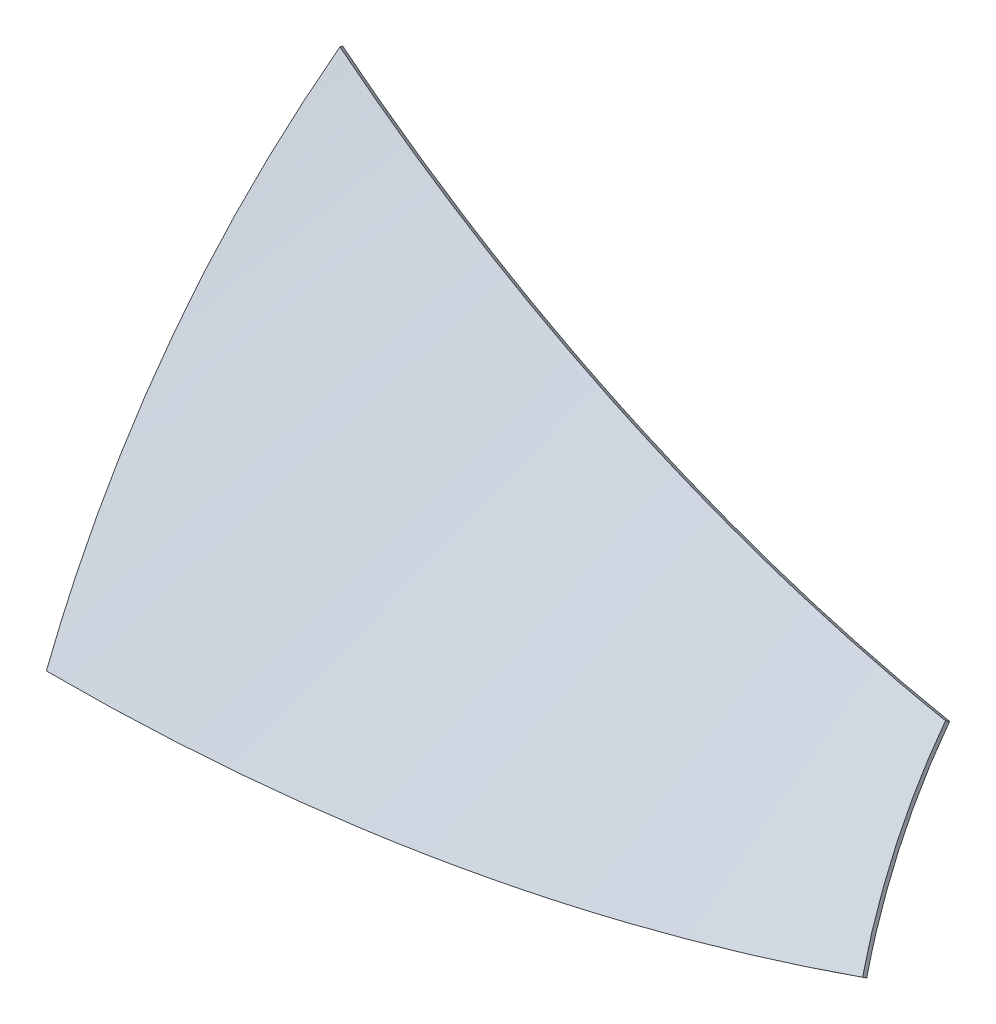
ISO-10303-21;
HEADER;
FILE_DESCRIPTION(('STEP AP214'),'2;1');
FILE_NAME('part.step','',(''),(''),'','','');
FILE_SCHEMA(('AUTOMOTIVE_DESIGN { 1 0 10303 214 1 1 1 1 }'));
ENDSEC;
DATA;
#1=APPLICATION_CONTEXT('core data for automotive mechanical design processes');
#2=APPLICATION_PROTOCOL_DEFINITION('international standard','automotive_design',2000,#1);
#3=PRODUCT_CONTEXT('',#1,'mechanical');
#4=PRODUCT('Part','Part','',(#3));
#5=PRODUCT_RELATED_PRODUCT_CATEGORY('part','',(#4));
#6=PRODUCT_DEFINITION_FORMATION('','',#4);
#7=PRODUCT_DEFINITION_CONTEXT('part definition',#1,'design');
#8=PRODUCT_DEFINITION('design','',#6,#7);
#9=PRODUCT_DEFINITION_SHAPE('','',#8);
#10=(LENGTH_UNIT() NAMED_UNIT(*) SI_UNIT(.MILLI.,.METRE.));
#11=(NAMED_UNIT(*) PLANE_ANGLE_UNIT() SI_UNIT($,.RADIAN.));
#12=(NAMED_UNIT(*) SI_UNIT($,.STERADIAN.) SOLID_ANGLE_UNIT());
#13=UNCERTAINTY_MEASURE_WITH_UNIT(LENGTH_MEASURE(1.E-05),#10,'distance_accuracy_value','');
#14=(GEOMETRIC_REPRESENTATION_CONTEXT(3) GLOBAL_UNCERTAINTY_ASSIGNED_CONTEXT((#13)) GLOBAL_UNIT_ASSIGNED_CONTEXT((#10,
#11,#12)) REPRESENTATION_CONTEXT('',''));
#15=CARTESIAN_POINT('',(0.,0.,0.));
#16=DIRECTION('',(0.,0.,1.));
#17=DIRECTION('',(1.,0.,0.));
#18=AXIS2_PLACEMENT_3D('',#15,#16,#17);
#19=CARTESIAN_POINT('',(119.275958422764,-87.4587045267184,-2.70380006520977));
#20=DIRECTION('',(0.,0.,1.));
#21=DIRECTION('',(1.,0.,0.));
#22=AXIS2_PLACEMENT_3D('',#19,#20,#21);
#23=CONICAL_SURFACE('',#22,60.5897364806192,0.959931088596881);
#24=CARTESIAN_POINT('',(88.2653044496329,-139.422911125247,-2.75685890943692));
#25=CARTESIAN_POINT('',(88.393896761644,-139.452100105852,-2.78545030760044));
#26=CARTESIAN_POINT('',(88.5225869281233,-139.480822216967,-2.81408465075337));
#27=CARTESIAN_POINT('',(89.1665572157071,-139.622109150888,-2.9574772601851));
#28=CARTESIAN_POINT('',(89.6832511441944,-139.727669930494,-3.07286608187321));
#29=CARTESIAN_POINT('',(90.7191910914132,-139.923853018244,-3.304871437824));
#30=CARTESIAN_POINT('',(91.2384371073349,-140.01447534283,-3.42148797073522));
#31=CARTESIAN_POINT('',(92.018860616663,-140.139187781278,-3.59725922924028));
#32=CARTESIAN_POINT('',(92.2792511609862,-140.178887152404,-3.65598852684919));
#33=CARTESIAN_POINT('',(93.0612000252367,-140.292381038128,-3.83260380131223));
#34=CARTESIAN_POINT('',(93.5834973477015,-140.360564654122,-3.95090857468665));
#35=CARTESIAN_POINT('',(94.3680143484509,-140.451571227305,-4.12913904036266));
#36=CARTESIAN_POINT('',(94.6296888622662,-140.480027769438,-4.18867587316264));
#37=CARTESIAN_POINT('',(95.4152550830907,-140.559760149398,-4.36768486040282));
#38=CARTESIAN_POINT('',(95.93965083618,-140.605393696889,-4.48754675442123));
#39=CARTESIAN_POINT('',(96.7268405724702,-140.662497319073,-4.66807199485579));
#40=CARTESIAN_POINT('',(96.9893268118299,-140.679640320303,-4.72836690461267));
#41=CARTESIAN_POINT('',(97.7770831924483,-140.725374175187,-4.90963991512032));
#42=CARTESIAN_POINT('',(98.3026117742748,-140.748266463702,-5.03099733539828));
#43=CARTESIAN_POINT('',(99.3538884486126,-140.778889220489,-5.27461795686905));
#44=CARTESIAN_POINT('',(99.8796365408709,-140.78661970618,-5.39688115702113));
#45=CARTESIAN_POINT('',(100.930958509344,-140.78702326399,-5.64218466158254));
#46=CARTESIAN_POINT('',(101.45653238575,-140.779696352731,-5.76522496513391));
#47=CARTESIAN_POINT('',(102.507097778709,-140.750050638456,-6.01197750042769));
#48=CARTESIAN_POINT('',(103.032089295673,-140.727731846034,-6.13568973169523));
#49=CARTESIAN_POINT('',(104.081086532354,-140.668155983594,-6.38369328141814));
#50=CARTESIAN_POINT('',(104.60509225239,-140.630898918403,-6.50798459968634));
#51=CARTESIAN_POINT('',(105.651712034309,-140.541480844823,-6.75706963427749));
#52=CARTESIAN_POINT('',(106.174326096123,-140.489319835691,-6.88186335062549));
#53=CARTESIAN_POINT('',(107.217745616381,-140.370115549256,-7.13188729522214));
#54=CARTESIAN_POINT('',(107.738551074074,-140.303072265766,-7.25711752365226));
#55=CARTESIAN_POINT('',(109.105530507758,-140.107147379602,-7.58703761521449));
#56=CARTESIAN_POINT('',(109.949870319747,-139.965924551795,-7.79205744793588));
#57=CARTESIAN_POINT('',(110.790394964173,-139.804906318109,-7.99752302693658));
#58=B_SPLINE_CURVE_WITH_KNOTS('',3,(#24,#25,#26,#27,#28,#29,#30,#31,#32,#33,#34,#35,#36,#37,#38,
#39,#40,#41,#42,#43,#44,#45,#46,#47,#48,#49,#50,#51,#52,#53,#54,#55,#56,#57),.UNSPECIFIED.,.F.,
.F.,(4,2,2,2,2,2,2,2,2,2,2,2,2,2,2,2,4),(0.,0.404785684554634,2.02408017378369,3.64337288067617,
4.45295905942151,6.07225061300535,6.88183676558975,8.50112882769166,9.31071515183369,
10.9300088916539,12.5493007712221,14.1685908633269,15.7878798111893,17.4071682357331,
19.0264567410057,20.6457459195014,23.2857187531543),.UNSPECIFIED.);
#59=CARTESIAN_POINT('',(88.2653044496328,-139.422911125247,-2.75685890943719));
#60=VERTEX_POINT('',#59);
#61=CARTESIAN_POINT('',(110.790394964173,-139.804906318109,-7.99752302693623));
#62=VERTEX_POINT('',#61);
#63=EDGE_CURVE('E24',#60,#62,#58,.T.);
#64=ORIENTED_EDGE('',*,*,#63,.T.);
#65=CARTESIAN_POINT('',(110.790394964173,-139.804906318109,-7.99752302693617));
#66=CARTESIAN_POINT('',(110.753714931839,-139.696425813194,-8.06839270908194));
#67=CARTESIAN_POINT('',(110.718354373568,-139.587667966176,-8.1395459575294));
#68=CARTESIAN_POINT('',(110.547999087685,-139.042323136617,-8.49686090490331));
#69=CARTESIAN_POINT('',(110.432678470962,-138.602026288922,-8.78704423252041));
#70=CARTESIAN_POINT('',(110.281985262496,-137.900229070604,-9.25266430868405));
#71=CARTESIAN_POINT('',(110.233269054765,-137.640044585737,-9.42595602925358));
#72=CARTESIAN_POINT('',(110.17365071207,-137.26846977861,-9.67445744911113));
#73=CARTESIAN_POINT('',(110.157097662991,-137.157425462057,-9.74885104371482));
#74=CARTESIAN_POINT('',(110.089033386873,-136.663417590621,-10.0804026850153));
#75=CARTESIAN_POINT('',(110.051054361181,-136.279734352034,-10.3394946224089));
#76=CARTESIAN_POINT('',(110.021033180158,-135.785115570535,-10.6757424971134));
#77=CARTESIAN_POINT('',(110.015519611322,-135.673894075686,-10.7514987942405));
#78=CARTESIAN_POINT('',(109.996821839207,-135.187314737827,-11.0835807574487));
#79=CARTESIAN_POINT('',(109.996546326534,-134.81236951143,-11.3411894895932));
#80=CARTESIAN_POINT('',(110.010517152515,-134.438391626709,-11.5999996128498));
#81=B_SPLINE_CURVE_WITH_KNOTS('',3,(#65,#66,#67,#68,#69,#70,#71,#72,#73,#74,#75,#76,#77,#78,#79,
#80),.UNSPECIFIED.,.F.,.F.,(4,2,2,2,2,2,2,4),(0.,0.404039967199959,2.02138933712613,
2.9702678466755,3.37430460638333,4.76665393130094,5.17069019074516,6.53488990231793),.UNSPECIFIED.);
#82=CARTESIAN_POINT('',(110.010517152602,-134.4383916244,-11.5999996144474));
#83=VERTEX_POINT('',#82);
#84=EDGE_CURVE('E119',#62,#83,#81,.T.);
#85=ORIENTED_EDGE('',*,*,#84,.T.);
#86=CARTESIAN_POINT('',(110.010517153382,-134.438391622229,-11.599999616045));
#87=CARTESIAN_POINT('',(109.876803936647,-134.412020499261,-11.599999649466));
#88=CARTESIAN_POINT('',(109.743202395256,-134.385070766238,-11.6000047399863));
#89=CARTESIAN_POINT('',(109.075705497752,-134.247423125822,-11.6000530761268));
#90=CARTESIAN_POINT('',(108.543566365259,-134.12807176212,-11.6001649766074));
#91=CARTESIAN_POINT('',(107.483723169382,-133.871150154111,-11.6004735845137));
#92=CARTESIAN_POINT('',(106.956019100151,-133.733579933825,-11.6006702918276));
#93=CARTESIAN_POINT('',(105.905626921944,-133.440450857818,-11.6010958966159));
#94=CARTESIAN_POINT('',(105.382938807397,-133.284892022079,-11.6013247940546));
#95=CARTESIAN_POINT('',(104.343181389047,-132.956029561148,-11.6017712994761));
#96=CARTESIAN_POINT('',(103.82611208022,-132.782725951826,-11.6019889074691));
#97=CARTESIAN_POINT('',(102.798159483365,-132.418613461905,-11.6023789968136));
#98=CARTESIAN_POINT('',(102.287276191183,-132.227804593061,-11.6025514781955));
#99=CARTESIAN_POINT('',(101.526099373397,-131.928681501401,-11.6027589088291));
#100=CARTESIAN_POINT('',(101.273245385349,-131.826828057125,-11.6028195019014));
#101=CARTESIAN_POINT('',(100.517259147392,-131.514819195498,-11.6029726866689));
#102=CARTESIAN_POINT('',(100.016757846375,-131.298235875793,-11.6030366646342));
#103=CARTESIAN_POINT('',(99.0234100832531,-130.848216474197,-11.6030799623007));
#104=CARTESIAN_POINT('',(98.5305636203959,-130.614780393961,-11.6030592820103));
#105=CARTESIAN_POINT('',(97.5530619650028,-130.131305526145,-11.6029358242948));
#106=CARTESIAN_POINT('',(97.0684067735595,-129.881266736349,-11.6028330468589));
#107=CARTESIAN_POINT('',(96.3480668456611,-129.494000669635,-11.6026274061331));
#108=CARTESIAN_POINT('',(96.1090734157178,-129.362884749245,-11.6025502856875));
#109=CARTESIAN_POINT('',(95.3954195726011,-128.963430755543,-11.602297081798));
#110=CARTESIAN_POINT('',(94.9241383024931,-128.689013635436,-11.6020991678235));
#111=CARTESIAN_POINT('',(93.991215395238,-128.124287084647,-11.6016733387489));
#112=CARTESIAN_POINT('',(93.5295737648934,-127.833977642752,-11.6014454236276));
#113=CARTESIAN_POINT('',(92.6164681118322,-127.237740316178,-11.6009981951386));
#114=CARTESIAN_POINT('',(92.1650040985576,-126.931812417011,-11.600778881779));
#115=CARTESIAN_POINT('',(91.4959306883048,-126.461478547329,-11.6004924206048));
#116=CARTESIAN_POINT('',(91.2742719131233,-126.302802597853,-11.600404022038));
#117=CARTESIAN_POINT('',(90.4966142481542,-125.735939214698,-11.6001296377114));
#118=CARTESIAN_POINT('',(89.948065510594,-125.317518889374,-11.6000013307998));
#119=CARTESIAN_POINT('',(89.4088257709597,-124.887220242252,-11.5999996160448));
#120=B_SPLINE_CURVE_WITH_KNOTS('',3,(#86,#87,#88,#89,#90,#91,#92,#93,#94,#95,#96,#97,#98,#99,
#100,#101,#102,#103,#104,#105,#106,#107,#108,#109,#110,#111,#112,#113,#114,#115,#116,#117,#118,
#119),.UNSPECIFIED.,.F.,.F.,(4,2,2,2,2,2,2,2,2,2,2,2,2,2,2,2,4),(0.,0.408872020931432,
2.04458807157775,3.68030196551314,5.31601404246981,6.95172465645626,8.58743417202632,
9.4052000757954,11.0409086426712,12.6766170488088,14.3123256731139,15.1300916031831,
16.7658012615432,18.4015120741467,20.0372244041636,20.8549909300658,22.9242005441208),.UNSPECIFIED.);
#121=CARTESIAN_POINT('',(89.4088257530934,-124.887220241614,-11.5999996085915));
#122=VERTEX_POINT('',#121);
#123=EDGE_CURVE('E69',#83,#122,#120,.T.);
#124=ORIENTED_EDGE('',*,*,#123,.T.);
#125=CARTESIAN_POINT('',(89.4088257352271,-124.887220240975,-11.5999996011381));
#126=CARTESIAN_POINT('',(89.3779016296209,-124.996054290545,-11.5269277917907));
#127=CARTESIAN_POINT('',(89.3474488187519,-125.105068137104,-11.4539215961558));
#128=CARTESIAN_POINT('',(89.2575290620644,-125.432662347292,-11.2350971924239));
#129=CARTESIAN_POINT('',(89.1995057781798,-125.651778424142,-11.0894846119513));
#130=CARTESIAN_POINT('',(89.1154720747801,-125.981523998152,-10.8715018771175));
#131=CARTESIAN_POINT('',(89.087959239955,-126.091625439398,-10.7989086351104));
#132=CARTESIAN_POINT('',(89.033947989512,-126.312178984535,-10.6538728286795));
#133=CARTESIAN_POINT('',(89.0074495927286,-126.422631094896,-10.581430267077));
#134=CARTESIAN_POINT('',(88.9293976915674,-126.75505361794,-10.3639894850818));
#135=CARTESIAN_POINT('',(88.8794241819064,-126.977554889442,-10.219232132844));
#136=CARTESIAN_POINT('',(88.7835652643354,-127.423845471213,-9.93034163110679));
#137=CARTESIAN_POINT('',(88.7376799818415,-127.647634820774,-9.7862085008859));
#138=CARTESIAN_POINT('',(88.6496567013939,-128.096326116415,-9.49848748289399));
#139=CARTESIAN_POINT('',(88.6075190225546,-128.321228155526,-9.35489964254991));
#140=CARTESIAN_POINT('',(88.5272840580926,-128.772152766182,-9.06835651004254));
#141=CARTESIAN_POINT('',(88.4891867466627,-128.99817533056,-8.92540121384451));
#142=CARTESIAN_POINT('',(88.4172349479171,-129.451324796017,-8.64018145245308));
#143=CARTESIAN_POINT('',(88.3833803780402,-129.678451675516,-8.49791697386858));
#144=CARTESIAN_POINT('',(88.3200294496898,-130.133763798179,-8.21411565139135));
#145=CARTESIAN_POINT('',(88.2905331270712,-130.361949050034,-8.0725788134941));
#146=CARTESIAN_POINT('',(88.2085815965716,-131.047916541384,-7.64910258577528));
#147=CARTESIAN_POINT('',(88.1626532131656,-131.507177303682,-7.36825546371118));
#148=CARTESIAN_POINT('',(88.1066369613637,-132.197852977602,-6.94954731925253));
#149=CARTESIAN_POINT('',(88.0901231052264,-132.428097211561,-6.81057089688105));
#150=CARTESIAN_POINT('',(88.0613475954916,-132.889270085304,-6.53337207064989));
#151=CARTESIAN_POINT('',(88.049085456169,-133.120198643867,-6.39514958243617));
#152=CARTESIAN_POINT('',(88.0186683029978,-133.813952903367,-5.98158965049347));
#153=CARTESIAN_POINT('',(88.0068834226983,-134.277736465273,-5.70736623630085));
#154=CARTESIAN_POINT('',(88.0004420309438,-135.207246749866,-5.16201602263873));
#155=CARTESIAN_POINT('',(88.0057855587841,-135.672973477007,-4.89088923027479));
#156=CARTESIAN_POINT('',(88.0268855693072,-136.372535467331,-4.48668119873469));
#157=CARTESIAN_POINT('',(88.0360989119511,-136.60587319435,-4.35236547514312));
#158=CARTESIAN_POINT('',(88.0685412327364,-137.269124372963,-3.97199696279422));
#159=CARTESIAN_POINT('',(88.097041293366,-137.699369706526,-3.72694484440436));
#160=CARTESIAN_POINT('',(88.1694739968244,-138.560725039361,-3.23966320797299));
#161=CARTESIAN_POINT('',(88.2134219660538,-138.991835473021,-2.99743674085369));
#162=CARTESIAN_POINT('',(88.2653044496327,-139.422911125247,-2.75685890943759));
#163=B_SPLINE_CURVE_WITH_KNOTS('',3,(#125,#126,#127,#128,#129,#130,#131,#132,#133,#134,#135,
#136,#137,#138,#139,#140,#141,#142,#143,#144,#145,#146,#147,#148,#149,#150,#151,#152,#153,#154,
#155,#156,#157,#158,#159,#160,#161,#162),.UNSPECIFIED.,.F.,.F.,(4,2,2,2,2,2,2,2,2,2,2,2,2,2,2,2,
2,2,4),(0.,0.40406407316356,1.21225538269907,1.61640710272107,2.02056632268259,2.8308530331569,
3.64116459255276,4.45154508529385,5.26192040149566,6.07227994582637,6.88264615654276,
8.50313984644146,9.31144172821436,10.1196512374433,11.7361079402654,13.3525683514841,
14.1607184706315,15.6483287339153,17.1374190917304),.UNSPECIFIED.);
#164=EDGE_CURVE('E66',#122,#60,#163,.T.);
#165=ORIENTED_EDGE('',*,*,#164,.T.);
#166=EDGE_LOOP('',(#64,#85,#124,#165));
#167=FACE_BOUND('',#166,.T.);
#168=ADVANCED_FACE('F17',(#167),#23,.F.);
#169=CARTESIAN_POINT('',(110.771855136703,-139.919275806318,-8.16299173988275));
#170=CARTESIAN_POINT('',(110.771916324252,-139.918898349262,-8.16244563851989));
#171=CARTESIAN_POINT('',(110.771977511802,-139.918520892205,-8.16189953715703));
#172=CARTESIAN_POINT('',(110.772038699351,-139.918143435148,-8.16135343579417));
#173=CARTESIAN_POINT('',(110.778157454292,-139.880397729468,-8.10674329950824));
#174=CARTESIAN_POINT('',(110.784276209232,-139.842652023788,-8.05213316322231));
#175=CARTESIAN_POINT('',(110.790394964173,-139.804906318109,-7.99752302693637));
#176=CARTESIAN_POINT('',(106.529021752458,-140.729057648899,-7.12789737510281));
#177=CARTESIAN_POINT('',(106.529111784376,-140.728684863256,-7.12735127373995));
#178=CARTESIAN_POINT('',(106.529201816294,-140.728312077614,-7.12680517237709));
#179=CARTESIAN_POINT('',(106.529291848212,-140.727939291971,-7.12625907101423));
#180=CARTESIAN_POINT('',(106.538295040007,-140.690660727702,-7.07164893472829));
#181=CARTESIAN_POINT('',(106.54729256614,-140.653382562773,-7.01703879844236));
#182=CARTESIAN_POINT('',(106.556295757936,-140.616103998504,-6.96242866215643));
#183=CARTESIAN_POINT('',(98.8666998516875,-141.273733770287,-5.3157213393941));
#184=CARTESIAN_POINT('',(98.8668377177738,-141.2733747024,-5.31517523803124));
#185=CARTESIAN_POINT('',(98.8669755838602,-141.273015634514,-5.31462913666838));
#186=CARTESIAN_POINT('',(98.8671134499465,-141.272656566627,-5.31408303530552));
#187=CARTESIAN_POINT('',(98.8809000585785,-141.236749777977,-5.25947289901958));
#188=CARTESIAN_POINT('',(98.894688945884,-141.200843072913,-5.20486276273365));
#189=CARTESIAN_POINT('',(98.908475554516,-141.164936284263,-5.15025262644772));
#190=CARTESIAN_POINT('',(91.3319014460328,-140.233816048849,-3.61624611019747));
#191=CARTESIAN_POINT('',(91.3320808911593,-140.233477836437,-3.61570000883461));
#192=CARTESIAN_POINT('',(91.3322603362858,-140.233139624025,-3.61515390747175));
#193=CARTESIAN_POINT('',(91.3324397814123,-140.232801411613,-3.61460780610889));
#194=CARTESIAN_POINT('',(91.3503842940632,-140.198980170416,-3.55999766982296));
#195=CARTESIAN_POINT('',(91.3683279987264,-140.165158807644,-3.50538753353703));
#196=CARTESIAN_POINT('',(91.3862725113773,-140.131337566447,-3.45077739725109));
#197=CARTESIAN_POINT('',(88.2059302159147,-139.522403865717,-2.9223276223833));
#198=CARTESIAN_POINT('',(88.2061261704814,-139.522075506838,-2.92178152102044));
#199=CARTESIAN_POINT('',(88.2063221250482,-139.521747147958,-2.92123541965758));
#200=CARTESIAN_POINT('',(88.2065180796149,-139.521418789079,-2.92068931829472));
#201=CARTESIAN_POINT('',(88.2261135362876,-139.488582901135,-2.86607918200878));
#202=CARTESIAN_POINT('',(88.2457089929602,-139.455747013191,-2.81146904572285));
#203=CARTESIAN_POINT('',(88.2653044496329,-139.422911125247,-2.75685890943692));
#204=B_SPLINE_SURFACE_WITH_KNOTS('',3,3,((#169,#170,#171,#172,#173,#174,#175),(#176,#177,#178,
#179,#180,#181,#182),(#183,#184,#185,#186,#187,#188,#189),(#190,#191,#192,#193,#194,#195,#196),
(#197,#198,#199,#200,#201,#202,#203)),.UNSPECIFIED.,.F.,.F.,.F.,(4,1,4),(4,3,4),(0.,
0.571428571428571,1.),(-0.01,0.,1.),.UNSPECIFIED.);
#205=DIRECTION('',(0.0917813241156244,0.566185585187649,0.81915204429294));
#206=VECTOR('',#205,1.);
#207=CARTESIAN_POINT('',(110.781308613086,-139.860958691043,-8.078619079321));
#208=LINE('',#207,#206);
#209=CARTESIAN_POINT('',(110.772463806536,-139.915517282349,-8.15755361789334));
#210=VERTEX_POINT('',#209);
#211=EDGE_CURVE('E78',#210,#62,#208,.T.);
#212=DIRECTION('',(-0.293931850090619,-0.492538319160002,-0.819152044288084));
#213=VECTOR('',#212,1.);
#214=CARTESIAN_POINT('',(88.2359112646239,-139.472164957163,-2.83877411386612));
#215=LINE('',#214,#213);
#216=CARTESIAN_POINT('',(88.2065180806895,-139.521418797936,-2.92068931335483));
#217=VERTEX_POINT('',#216);
#218=EDGE_CURVE('E73',#60,#217,#215,.T.);
#219=CARTESIAN_POINT('',(110.772463182779,-139.915517401564,-8.15755346593861));
#220=CARTESIAN_POINT('',(110.644849174168,-139.939907286284,-8.12646529683646));
#221=CARTESIAN_POINT('',(110.517144155725,-139.963841517229,-8.09538663302451));
#222=CARTESIAN_POINT('',(109.878136387115,-140.081243113899,-7.94003117576611));
#223=CARTESIAN_POINT('',(109.365523506516,-140.167875110313,-7.81590158313757));
#224=CARTESIAN_POINT('',(108.337975106382,-140.326563485748,-7.56799575319069));
#225=CARTESIAN_POINT('',(107.823039589188,-140.398619879462,-7.44421951551629));
#226=CARTESIAN_POINT('',(106.791237537342,-140.528161858453,-7.19705740246975));
#227=CARTESIAN_POINT('',(106.274371003972,-140.585647453406,-7.07367152683845));
#228=CARTESIAN_POINT('',(105.239139560791,-140.686033595775,-6.82735366669601));
#229=CARTESIAN_POINT('',(104.720774651458,-140.728934147835,-6.70442168204037));
#230=CARTESIAN_POINT('',(103.163579531522,-140.835748660092,-6.33629984914824));
#231=CARTESIAN_POINT('',(102.122941697178,-140.877738743054,-6.09185421733532));
#232=CARTESIAN_POINT('',(100.561352393301,-140.896556910425,-5.72736403961631));
#233=CARTESIAN_POINT('',(100.040790707162,-140.895471741213,-5.60624729730924));
#234=CARTESIAN_POINT('',(98.9996876598481,-140.878513899878,-5.36481548478957));
#235=CARTESIAN_POINT('',(98.4791462986979,-140.8626412109,-5.24450041549079));
#236=CARTESIAN_POINT('',(97.6987241074171,-140.827668914312,-5.06474376589633));
#237=CARTESIAN_POINT('',(97.4386577210994,-140.814151626798,-5.00494635137016));
#238=CARTESIAN_POINT('',(96.6586484646242,-140.768026365461,-4.82589844801075));
#239=CARTESIAN_POINT('',(96.138933241818,-140.729846145057,-4.70700102172678));
#240=CARTESIAN_POINT('',(95.3602309993229,-140.661506728755,-4.52940004227218));
#241=CARTESIAN_POINT('',(95.1008181103966,-140.63688317341,-4.47032604581158));
#242=CARTESIAN_POINT('',(93.8041094233551,-140.504515089677,-4.17547187761334));
#243=CARTESIAN_POINT('',(92.7690038719492,-140.369112849225,-3.94149550076689));
#244=CARTESIAN_POINT('',(91.1463985393248,-140.109904291585,-3.57668835298127));
#245=CARTESIAN_POINT('',(90.5559906856174,-140.005712486013,-3.44436207563823));
#246=CARTESIAN_POINT('',(89.3785790082043,-139.778036230486,-3.1813030268735));
#247=CARTESIAN_POINT('',(88.7915750322265,-139.654552650561,-3.05057018387683));
#248=CARTESIAN_POINT('',(88.2065181335944,-139.521418801363,-2.92068933027754));
#249=B_SPLINE_CURVE_WITH_KNOTS('',3,(#219,#220,#221,#222,#223,#224,#225,#226,#227,#228,#229,
#230,#231,#232,#233,#234,#235,#236,#237,#238,#239,#240,#241,#242,#243,#244,#245,#246,#247,#248),
.UNSPECIFIED.,.F.,.F.,(4,2,2,2,2,2,2,2,2,2,2,2,2,2,4),(0.,0.400777805369769,2.00403344775429,
3.60728747401919,5.21054043569948,6.81379288692716,10.0212064599414,11.6244608019715,
13.2277169712351,14.0292872606117,15.6325440739654,16.4341141294991,19.6415499085026,
21.4831709053136,23.3247088717892),.UNSPECIFIED.);
#250=EDGE_CURVE('E113',#210,#217,#249,.T.);
#251=ORIENTED_EDGE('',*,*,#211,.T.);
#252=ORIENTED_EDGE('',*,*,#63,.F.);
#253=ORIENTED_EDGE('',*,*,#218,.T.);
#254=ORIENTED_EDGE('',*,*,#250,.F.);
#255=EDGE_LOOP('',(#251,#252,#253,#254));
#256=FACE_BOUND('',#255,.T.);
#257=ADVANCED_FACE('F75',(#256),#204,.F.);
#258=CARTESIAN_POINT('',(88.2059302159147,-139.522403865717,-2.92232762238352));
#259=CARTESIAN_POINT('',(88.2061261704814,-139.522075506838,-2.92178152102066));
#260=CARTESIAN_POINT('',(88.2063221250482,-139.521747147958,-2.9212354196578));
#261=CARTESIAN_POINT('',(88.2065180796149,-139.521418789079,-2.92068931829494));
#262=CARTESIAN_POINT('',(88.2261135362876,-139.488582901135,-2.86607918200906));
#263=CARTESIAN_POINT('',(88.2457089929602,-139.455747013191,-2.81146904572318));
#264=CARTESIAN_POINT('',(88.2653044496328,-139.422911125247,-2.75685890943731));
#265=CARTESIAN_POINT('',(88.2655023637452,-139.422579482779,-2.75630734706082));
#266=CARTESIAN_POINT('',(88.2657002778576,-139.422247840311,-2.75575578468434));
#267=CARTESIAN_POINT('',(88.26589819197,-139.421916197842,-2.75520422230785));
#268=CARTESIAN_POINT('',(87.8498503803487,-136.587857672912,-4.55903629348517));
#269=CARTESIAN_POINT('',(87.8500561438002,-136.587535161323,-4.55849019212231));
#270=CARTESIAN_POINT('',(87.8502619072518,-136.587212649734,-4.55794409075945));
#271=CARTESIAN_POINT('',(87.8504676707033,-136.586890138145,-4.55739798939659));
#272=CARTESIAN_POINT('',(87.8710440158557,-136.554638979259,-4.50278785311071));
#273=CARTESIAN_POINT('',(87.8916178116388,-136.522388204817,-4.44817771682482));
#274=CARTESIAN_POINT('',(87.9121941567912,-136.490137045931,-4.39356758053894));
#275=CARTESIAN_POINT('',(87.9124019778772,-136.489811309226,-4.39301601816245));
#276=CARTESIAN_POINT('',(87.9126097989633,-136.489485572521,-4.39246445578597));
#277=CARTESIAN_POINT('',(87.9128176200493,-136.489159835817,-4.39191289340948));
#278=CARTESIAN_POINT('',(87.8711893638283,-132.575579335741,-6.90066490513928));
#279=CARTESIAN_POINT('',(87.8714074200412,-132.575265010037,-6.90011880377642));
#280=CARTESIAN_POINT('',(87.8716254762542,-132.574950684333,-6.89957270241356));
#281=CARTESIAN_POINT('',(87.8718435324671,-132.574636358629,-6.8990266010507));
#282=CARTESIAN_POINT('',(87.8936491537624,-132.543203788214,-6.8444164647648));
#283=CARTESIAN_POINT('',(87.9154535310117,-132.511770355278,-6.7898063284789));
#284=CARTESIAN_POINT('',(87.9372591523071,-132.480337784863,-6.73519619219299));
#285=CARTESIAN_POINT('',(87.9374793890822,-132.480020315902,-6.7346446298165));
#286=CARTESIAN_POINT('',(87.9376996258573,-132.479702846941,-6.73409306744001));
#287=CARTESIAN_POINT('',(87.9379198626324,-132.479385377979,-6.73354150506353));
#288=CARTESIAN_POINT('',(88.4744336826358,-128.664095752218,-9.35520755921663));
#289=CARTESIAN_POINT('',(88.4746625656083,-128.663789411252,-9.35466145785377));
#290=CARTESIAN_POINT('',(88.4748914485808,-128.663483070285,-9.35411535649091));
#291=CARTESIAN_POINT('',(88.4751203315533,-128.663176729319,-9.35356925512805));
#292=CARTESIAN_POINT('',(88.4980086288024,-128.63254263269,-9.29895911884214));
#293=CARTESIAN_POINT('',(88.5208993438843,-128.601910112015,-9.24434898255622));
#294=CARTESIAN_POINT('',(88.5437876411334,-128.571276015386,-9.18973884627031));
#295=CARTESIAN_POINT('',(88.5440188129356,-128.57096661101,-9.18918728389382));
#296=CARTESIAN_POINT('',(88.5442499847378,-128.570657206634,-9.18863572151734));
#297=CARTESIAN_POINT('',(88.5444811565401,-128.570347802258,-9.18808415914085));
#298=CARTESIAN_POINT('',(88.8932002376887,-126.647346223877,-10.6557949244372));
#299=CARTESIAN_POINT('',(88.8934345062393,-126.647043988103,-10.6552488230743));
#300=CARTESIAN_POINT('',(88.89366877479,-126.646741752328,-10.6547027217115));
#301=CARTESIAN_POINT('',(88.8939030433406,-126.646439516554,-10.6541566203486));
#302=CARTESIAN_POINT('',(88.9173298984038,-126.616215939123,-10.5995464840626));
#303=CARTESIAN_POINT('',(88.9407539735831,-126.585990732364,-10.5449363477767));
#304=CARTESIAN_POINT('',(88.9641808286463,-126.555767154933,-10.4903262114908));
#305=CARTESIAN_POINT('',(88.9644174398824,-126.555461896801,-10.4897746491143));
#306=CARTESIAN_POINT('',(88.9646540511186,-126.555156638669,-10.4892230867378));
#307=CARTESIAN_POINT('',(88.9648906623547,-126.554851380537,-10.4886715243613));
#308=CARTESIAN_POINT('',(89.1473225436593,-125.645975795307,-11.3171126533402));
#309=CARTESIAN_POINT('',(89.1475593602472,-125.645675563887,-11.3165665519773));
#310=CARTESIAN_POINT('',(89.1477961768351,-125.645375332466,-11.3160204506145));
#311=CARTESIAN_POINT('',(89.148032993423,-125.645075101046,-11.3154743492516));
#312=CARTESIAN_POINT('',(89.1717146522129,-125.615051959002,-11.2608642129657));
#313=CARTESIAN_POINT('',(89.1954005686143,-125.585031510392,-11.2062540766797));
#314=CARTESIAN_POINT('',(89.2190822274042,-125.555008368349,-11.1516439403938));
#315=CARTESIAN_POINT('',(89.219321412158,-125.554705134614,-11.1510923780173));
#316=CARTESIAN_POINT('',(89.2195605969118,-125.55440190088,-11.1505408156408));
#317=CARTESIAN_POINT('',(89.2197997816655,-125.554098667145,-11.1499892532643));
#318=CARTESIAN_POINT('',(89.3365587519524,-124.977782870094,-11.7654683091632));
#319=CARTESIAN_POINT('',(89.3367972568409,-124.977483983553,-11.7649222078003));
#320=CARTESIAN_POINT('',(89.3370357617293,-124.977185097013,-11.7643761064375));
#321=CARTESIAN_POINT('',(89.3372742666177,-124.976886210472,-11.7638300050746));
#322=CARTESIAN_POINT('',(89.3611247554599,-124.946997556416,-11.7092198687886));
#323=CARTESIAN_POINT('',(89.3849752443021,-124.917108902361,-11.6546097325027));
#324=CARTESIAN_POINT('',(89.4088257331443,-124.887220248305,-11.5999995962168));
#325=CARTESIAN_POINT('',(89.4090666230816,-124.886918372899,-11.5994480338403));
#326=CARTESIAN_POINT('',(89.4093075130189,-124.886616497493,-11.5988964714638));
#327=CARTESIAN_POINT('',(89.4095484029562,-124.886314622087,-11.5983449090873));
#328=B_SPLINE_SURFACE_WITH_KNOTS('',3,3,((#258,#259,#260,#261,#262,#263,#264,#265,#266,#267),
(#268,#269,#270,#271,#272,#273,#274,#275,#276,#277),(#278,#279,#280,#281,#282,#283,#284,#285,
#286,#287),(#288,#289,#290,#291,#292,#293,#294,#295,#296,#297),(#298,#299,#300,#301,#302,#303,
#304,#305,#306,#307),(#308,#309,#310,#311,#312,#313,#314,#315,#316,#317),(#318,#319,#320,#321,
#322,#323,#324,#325,#326,#327)),.UNSPECIFIED.,.F.,.F.,.F.,(4,1,1,1,4),(4,3,3,4),(0.,
0.571428571428571,0.785714285714286,0.857142857142857,1.),(-0.01,0.,1.,1.0101),.UNSPECIFIED.);
#329=DIRECTION('',(-0.357757332400664,-0.448329811024342,-0.819152044287529));
#330=VECTOR('',#329,1.);
#331=CARTESIAN_POINT('',(89.372410880464,-124.932854233903,-11.6833783341897));
#332=LINE('',#331,#330);
#333=CARTESIAN_POINT('',(89.3374905445875,-124.97661535623,-11.7633350556306));
#334=VERTEX_POINT('',#333);
#335=EDGE_CURVE('E84',#122,#334,#332,.T.);
#336=CARTESIAN_POINT('',(88.2065180817642,-139.521418806794,-2.92068930841492));
#337=CARTESIAN_POINT('',(88.1924666399635,-139.405603670899,-2.98528436375661));
#338=CARTESIAN_POINT('',(88.1789893748951,-139.289783774794,-3.0499998796975));
#339=CARTESIAN_POINT('',(88.1144428502647,-138.710622785762,-3.37420292526912));
#340=CARTESIAN_POINT('',(88.071917036979,-138.247290203705,-3.635459319896));
#341=CARTESIAN_POINT('',(88.0043893935845,-137.320099258902,-4.16211282264863));
#342=CARTESIAN_POINT('',(87.9794342711231,-136.856242753378,-4.42751906440366));
#343=CARTESIAN_POINT('',(87.9467547229883,-135.929754725397,-4.96159861362));
#344=CARTESIAN_POINT('',(87.9390316735041,-135.467123303725,-5.23027218029402));
#345=CARTESIAN_POINT('',(87.9404974797572,-134.543704904211,-5.77068332868216));
#346=CARTESIAN_POINT('',(87.9496858712078,-134.082917876081,-6.04242082607558));
#347=CARTESIAN_POINT('',(87.9848096658116,-133.163777283284,-6.58883139119122));
#348=CARTESIAN_POINT('',(88.0107434119266,-132.70542348236,-6.86350416580823));
#349=CARTESIAN_POINT('',(88.0621731171355,-132.020793175784,-7.27729368850691));
#350=CARTESIAN_POINT('',(88.0813699323196,-131.793373974579,-7.41533121450049));
#351=CARTESIAN_POINT('',(88.1239574603981,-131.339336326695,-7.69214015338551));
#352=CARTESIAN_POINT('',(88.1473486633387,-131.112717976741,-7.830911650189));
#353=CARTESIAN_POINT('',(88.1983672813514,-130.660392709657,-8.10917792123726));
#354=CARTESIAN_POINT('',(88.2259948539349,-130.434685826736,-8.24867272218863));
#355=CARTESIAN_POINT('',(88.2855140577244,-129.984283673581,-8.52837636299576));
#356=CARTESIAN_POINT('',(88.3174056236367,-129.759588387912,-8.66858519188614));
#357=CARTESIAN_POINT('',(88.3853693846745,-129.311263575179,-8.94968784703521));
#358=CARTESIAN_POINT('',(88.4214415553643,-129.087634041894,-9.0905816692855));
#359=CARTESIAN_POINT('',(88.4976138229485,-128.641475005424,-9.37300623413991));
#360=CARTESIAN_POINT('',(88.5377138261988,-128.418945476792,-9.51453696186341));
#361=CARTESIAN_POINT('',(88.6216321180187,-127.974947470667,-9.7981588137));
#362=CARTESIAN_POINT('',(88.6654504138918,-127.753478995258,-9.94024993891333));
#363=CARTESIAN_POINT('',(88.7557739340661,-127.3171872075,-10.2214757905691));
#364=CARTESIAN_POINT('',(88.802185455798,-127.102335411417,-10.3605963456456));
#365=CARTESIAN_POINT('',(88.8989411341029,-126.673916755079,-10.6394453532433));
#366=CARTESIAN_POINT('',(88.9492852664751,-126.460349886926,-10.7791738020186));
#367=CARTESIAN_POINT('',(89.053808002982,-126.034315489697,-11.0593312343303));
#368=CARTESIAN_POINT('',(89.1079902240138,-125.821849205627,-11.1997607595451));
#369=CARTESIAN_POINT('',(89.2200216443134,-125.398236779639,-11.4811553656045));
#370=CARTESIAN_POINT('',(89.2778709014126,-125.187090658599,-11.6221204548624));
#371=CARTESIAN_POINT('',(89.3374904043291,-124.976615435055,-11.7633349512188));
#372=B_SPLINE_CURVE_WITH_KNOTS('',3,(#336,#337,#338,#339,#340,#341,#342,#343,#344,#345,#346,
#347,#348,#349,#350,#351,#352,#353,#354,#355,#356,#357,#358,#359,#360,#361,#362,#363,#364,#365,
#366,#367,#368,#369,#370,#371),.UNSPECIFIED.,.F.,.F.,(4,2,2,2,2,2,2,2,2,2,2,2,2,2,2,2,2,4),(0.,
0.400064411515165,2.000544317482,3.60526283103912,5.21010949617682,6.81491210251641,
8.41955592979846,9.21970315865256,10.0199439327497,10.820214467639,11.6204727495502,
12.4207263541887,13.2209613578325,14.0211979333706,14.8015694251672,15.5819361150451,
16.3630482412991,17.1441726892875),.UNSPECIFIED.);
#373=EDGE_CURVE('E81',#217,#334,#372,.T.);
#374=ORIENTED_EDGE('',*,*,#218,.F.);
#375=ORIENTED_EDGE('',*,*,#164,.F.);
#376=ORIENTED_EDGE('',*,*,#335,.T.);
#377=ORIENTED_EDGE('',*,*,#373,.F.);
#378=EDGE_LOOP('',(#374,#375,#376,#377));
#379=FACE_BOUND('',#378,.T.);
#380=ADVANCED_FACE('F79',(#379),#328,.F.);
#381=CARTESIAN_POINT('',(89.3359961383807,-124.978488000028,-11.7667566683794));
#382=CARTESIAN_POINT('',(89.3364221442761,-124.977954143346,-11.7657812485389));
#383=CARTESIAN_POINT('',(89.3368481501716,-124.977420286663,-11.7648058286983));
#384=CARTESIAN_POINT('',(89.337274156067,-124.976886429981,-11.7638304088578));
#385=CARTESIAN_POINT('',(89.3611246448938,-124.946997775913,-11.7092202725719));
#386=CARTESIAN_POINT('',(89.3849751337205,-124.917109121845,-11.6546101362859));
#387=CARTESIAN_POINT('',(89.4088256225473,-124.887220467777,-11.6));
#388=CARTESIAN_POINT('',(89.4090683874945,-124.886916242669,-11.5994441444387));
#389=CARTESIAN_POINT('',(89.4093111524418,-124.886612017562,-11.5988882888775));
#390=CARTESIAN_POINT('',(89.409553917389,-124.886307792454,-11.5983324333162));
#391=CARTESIAN_POINT('',(95.3239476675761,-129.756742072275,-11.7667566683794));
#392=CARTESIAN_POINT('',(95.324288522052,-129.756140131358,-11.7657812485389));
#393=CARTESIAN_POINT('',(95.3246293765279,-129.755538190441,-11.7648058286983));
#394=CARTESIAN_POINT('',(95.3249702310037,-129.754936249524,-11.7638304088578));
#395=CARTESIAN_POINT('',(95.3440534079152,-129.721235811883,-11.7092202725719));
#396=CARTESIAN_POINT('',(95.3631283247337,-129.6875515033,-11.6546101362859));
#397=CARTESIAN_POINT('',(95.3822115016452,-129.653851065659,-11.6));
#398=CARTESIAN_POINT('',(95.3824057419591,-129.653508041873,-11.5994441444387));
#399=CARTESIAN_POINT('',(95.382599982273,-129.653165018088,-11.5988882888775));
#400=CARTESIAN_POINT('',(95.3827942225868,-129.652821994302,-11.5983324333162));
#401=CARTESIAN_POINT('',(102.471940451248,-133.07063037331,-11.7667566683794));
#402=CARTESIAN_POINT('',(102.472179591612,-133.069981276608,-11.7657812485389));
#403=CARTESIAN_POINT('',(102.472418731976,-133.069332179907,-11.7648058286983));
#404=CARTESIAN_POINT('',(102.47265787234,-133.068683083206,-11.7638304088578));
#405=CARTESIAN_POINT('',(102.486046453674,-133.032342568238,-11.7092202725719));
#406=CARTESIAN_POINT('',(102.499428063021,-132.996018779509,-11.6546101362859));
#407=CARTESIAN_POINT('',(102.512816644355,-132.959678264542,-11.6));
#408=CARTESIAN_POINT('',(102.512952921572,-132.959308368425,-11.5994441444387));
#409=CARTESIAN_POINT('',(102.513089198789,-132.958938472309,-11.5988882888775));
#410=CARTESIAN_POINT('',(102.513225476006,-132.958568576192,-11.5983324333162));
#411=CARTESIAN_POINT('',(109.987923793994,-134.552949463962,-11.7667566683794));
#412=CARTESIAN_POINT('',(109.988055950389,-134.55227937541,-11.7657812485389));
#413=CARTESIAN_POINT('',(109.988188106785,-134.551609286858,-11.7648058286983));
#414=CARTESIAN_POINT('',(109.988320263181,-134.550939198306,-11.7638304088578));
#415=CARTESIAN_POINT('',(109.995719209241,-134.513423427536,-11.7092202725719));
#416=CARTESIAN_POINT('',(110.003118155301,-134.475907656766,-11.6546101362859));
#417=CARTESIAN_POINT('',(110.010517101361,-134.438391885996,-11.6));
#418=CARTESIAN_POINT('',(110.010592412386,-134.438010027403,-11.5994441444387));
#419=CARTESIAN_POINT('',(110.01066772341,-134.43762816881,-11.5988882888775));
#420=CARTESIAN_POINT('',(110.010743034435,-134.437246310216,-11.5983324333162));
#421=B_SPLINE_SURFACE_WITH_KNOTS('',3,3,((#381,#382,#383,#384,#385,#386,#387,#388,#389,#390),
(#391,#392,#393,#394,#395,#396,#397,#398,#399,#400),(#401,#402,#403,#404,#405,#406,#407,#408,
#409,#410),(#411,#412,#413,#414,#415,#416,#417,#418,#419,#420)),.UNSPECIFIED.,.F.,.F.,.F.,(4,4),
(4,3,3,4),(0.,1.),(-0.0178615163206738,0.,1.,1.01017861516321),.UNSPECIFIED.);
#422=DIRECTION('',(-0.110984190900181,-0.562736561550796,-0.819152044289837));
#423=VECTOR('',#422,1.);
#424=CARTESIAN_POINT('',(109.999529717619,-134.494102546199,-11.6810956653055));
#425=LINE('',#424,#423);
#426=CARTESIAN_POINT('',(109.988747460768,-134.548773076364,-11.7606773996099));
#427=VERTEX_POINT('',#426);
#428=EDGE_CURVE('E45',#83,#427,#425,.T.);
#429=CARTESIAN_POINT('',(89.3374905920103,-124.97661539408,-11.7633350556399));
#430=CARTESIAN_POINT('',(89.4440102129541,-125.061634396566,-11.7633558068636));
#431=CARTESIAN_POINT('',(89.5508987082237,-125.146195062228,-11.7633809560978));
#432=CARTESIAN_POINT('',(90.0872207007892,-125.566739076098,-11.7635263085441));
#433=CARTESIAN_POINT('',(90.5221155468603,-125.895802214249,-11.7637052995405));
#434=CARTESIAN_POINT('',(91.4029288483669,-126.538797228543,-11.7641272290209));
#435=CARTESIAN_POINT('',(91.8488472893652,-126.852729124502,-11.7643701674212));
#436=CARTESIAN_POINT('',(92.7511585581956,-127.465167876761,-11.7648675373792));
#437=CARTESIAN_POINT('',(93.2075513744646,-127.763674750088,-11.7651219689243));
#438=CARTESIAN_POINT('',(94.1302376520302,-128.344961737321,-11.7655989597039));
#439=CARTESIAN_POINT('',(94.596531104519,-128.627741865218,-11.7658215189669));
#440=CARTESIAN_POINT('',(95.5384711306924,-129.177297992488,-11.7662009936044));
#441=CARTESIAN_POINT('',(96.0141176981207,-129.444074002566,-11.7663579090229));
#442=CARTESIAN_POINT('',(96.7341080897316,-129.831989045792,-11.7665266172835));
#443=CARTESIAN_POINT('',(96.9751784109811,-129.959246004381,-11.7665717419202));
#444=CARTESIAN_POINT('',(97.7016437140617,-130.33489524855,-11.7666708248365));
#445=CARTESIAN_POINT('',(98.1902417831644,-130.577137158288,-11.7666884745783));
#446=CARTESIAN_POINT('',(99.1753486056557,-131.04491947233,-11.7666185410431));
#447=CARTESIAN_POINT('',(99.6718573582438,-131.270459878324,-11.7665309577767));
#448=CARTESIAN_POINT('',(100.672249805987,-131.704592132317,-11.7662530005991));
#449=CARTESIAN_POINT('',(101.176133502088,-131.913183978142,-11.7660626266747));
#450=CARTESIAN_POINT('',(101.936982895165,-132.213137614209,-11.7657099629033));
#451=CARTESIAN_POINT('',(102.191422826157,-132.310961549475,-11.7655812332401));
#452=CARTESIAN_POINT('',(102.957253034133,-132.597961057124,-11.7651653301448));
#453=CARTESIAN_POINT('',(103.471099120448,-132.780641725526,-11.76484846407));
#454=CARTESIAN_POINT('',(104.504693053808,-133.12841024867,-11.7641635520833));
#455=CARTESIAN_POINT('',(105.024440904958,-133.293498091181,-11.7637955061359));
#456=CARTESIAN_POINT('',(106.069283650658,-133.605848172886,-11.7630465624757));
#457=CARTESIAN_POINT('',(106.594378550103,-133.753110395764,-11.7626656647511));
#458=CARTESIAN_POINT('',(107.385509307662,-133.960437273513,-11.762120534832));
#459=CARTESIAN_POINT('',(107.64978643029,-134.027281875759,-11.7619432032744));
#460=CARTESIAN_POINT('',(108.602427889865,-134.259559176818,-11.7613338814399));
#461=CARTESIAN_POINT('',(109.293982954062,-134.411939082114,-11.7609475150585));
#462=CARTESIAN_POINT('',(109.988746327122,-134.548772911038,-11.7606773602368));
#463=B_SPLINE_CURVE_WITH_KNOTS('',3,(#429,#430,#431,#432,#433,#434,#435,#436,#437,#438,#439,
#440,#441,#442,#443,#444,#445,#446,#447,#448,#449,#450,#451,#452,#453,#454,#455,#456,#457,#458,
#459,#460,#461,#462),.UNSPECIFIED.,.F.,.F.,(4,2,2,2,2,2,2,2,2,2,2,2,2,2,2,2,4),(0.,
0.408872008566458,2.04458727545209,3.68030040020366,5.31601171928949,6.95172158328354,
8.58743035318605,9.40519616393087,11.0409039848098,12.6766116401523,14.3123195052292,
15.1300853392576,16.7657942191029,18.4015042361035,20.0372157502704,20.8549821718934,
22.9788418860435),.UNSPECIFIED.);
#464=EDGE_CURVE('E36',#334,#427,#463,.T.);
#465=ORIENTED_EDGE('',*,*,#335,.F.);
#466=ORIENTED_EDGE('',*,*,#123,.F.);
#467=ORIENTED_EDGE('',*,*,#428,.T.);
#468=ORIENTED_EDGE('',*,*,#464,.F.);
#469=EDGE_LOOP('',(#465,#466,#467,#468));
#470=FACE_BOUND('',#469,.T.);
#471=ADVANCED_FACE('F138',(#470),#421,.F.);
#472=CARTESIAN_POINT('',(109.990285748537,-134.497956195275,-11.8004941054633));
#473=CARTESIAN_POINT('',(109.997691185349,-134.460441697842,-11.7458839691774));
#474=CARTESIAN_POINT('',(110.005096666827,-134.422927229571,-11.6912738328915));
#475=CARTESIAN_POINT('',(110.012502103638,-134.385412732137,-11.6366636966055));
#476=CARTESIAN_POINT('',(110.012576158006,-134.385037587163,-11.6361175952427));
#477=CARTESIAN_POINT('',(110.012650212374,-134.384662442188,-11.6355714938798));
#478=CARTESIAN_POINT('',(110.012724266742,-134.384287297214,-11.6350253925169));
#479=CARTESIAN_POINT('',(109.989630603804,-134.515617109822,-11.7882727442351));
#480=CARTESIAN_POINT('',(109.997033877032,-134.478102187943,-11.7336626079492));
#481=CARTESIAN_POINT('',(110.004437180037,-134.440587285506,-11.6790524716633));
#482=CARTESIAN_POINT('',(110.011840453265,-134.403072363627,-11.6244423353773));
#483=CARTESIAN_POINT('',(110.011914485997,-134.402697214408,-11.6238962340145));
#484=CARTESIAN_POINT('',(110.011988518729,-134.402322065189,-11.6233501326516));
#485=CARTESIAN_POINT('',(110.012062551462,-134.40194691597,-11.6228040312887));
#486=CARTESIAN_POINT('',(109.988975459071,-134.533278024369,-11.7760513830069));
#487=CARTESIAN_POINT('',(109.996376568715,-134.495762678045,-11.721441246721));
#488=CARTESIAN_POINT('',(110.003777693248,-134.458247341441,-11.6668311104351));
#489=CARTESIAN_POINT('',(110.011178802892,-134.420731995116,-11.6122209741491));
#490=CARTESIAN_POINT('',(110.011252813988,-134.420356841653,-11.6116748727862));
#491=CARTESIAN_POINT('',(110.011326825085,-134.41998168819,-11.6111287714234));
#492=CARTESIAN_POINT('',(110.011400836181,-134.419606534727,-11.6105826700605));
#493=CARTESIAN_POINT('',(109.988320314338,-134.550938938916,-11.7638300217787));
#494=CARTESIAN_POINT('',(109.995719260398,-134.513423168146,-11.7092198854928));
#495=CARTESIAN_POINT('',(110.003118206459,-134.475907397376,-11.6546097492069));
#496=CARTESIAN_POINT('',(110.010517152519,-134.438391626606,-11.5999996129209));
#497=CARTESIAN_POINT('',(110.01059114198,-134.438016468898,-11.599453511558));
#498=CARTESIAN_POINT('',(110.01066513144,-134.437641311191,-11.5989074101952));
#499=CARTESIAN_POINT('',(110.010739120901,-134.437266153483,-11.5983613088323));
#500=CARTESIAN_POINT('',(109.922805841025,-136.317030393601,-10.5416938989582));
#501=CARTESIAN_POINT('',(109.929988428712,-136.279472178289,-10.4870837626723));
#502=CARTESIAN_POINT('',(109.937169527541,-136.241912990889,-10.4324736263863));
#503=CARTESIAN_POINT('',(109.944352115228,-136.204354775577,-10.3778634901004));
#504=CARTESIAN_POINT('',(109.944423941105,-136.203979193424,-10.3773173887375));
#505=CARTESIAN_POINT('',(109.944495766982,-136.203603611271,-10.3767712873747));
#506=CARTESIAN_POINT('',(109.944567592859,-136.203228029118,-10.3762251860118));
#507=CARTESIAN_POINT('',(110.17583705799,-138.160169993433,-9.30963726457908));
#508=CARTESIAN_POINT('',(110.182573798532,-138.122524637999,-9.25502712829314));
#509=CARTESIAN_POINT('',(110.189309958098,-138.084878672694,-9.20041699200721));
#510=CARTESIAN_POINT('',(110.196046698641,-138.04723331726,-9.14580685572128));
#511=CARTESIAN_POINT('',(110.196114066046,-138.046856863706,-9.14526075435842));
#512=CARTESIAN_POINT('',(110.196181433452,-138.046480410151,-9.14471465299556));
#513=CARTESIAN_POINT('',(110.196248800857,-138.046103956597,-9.1441685516327));
#514=CARTESIAN_POINT('',(110.772038699351,-139.918143435147,-8.16135343579418));
#515=CARTESIAN_POINT('',(110.778157454292,-139.880397729468,-8.10674329950825));
#516=CARTESIAN_POINT('',(110.784276209232,-139.842652023788,-8.05213316322232));
#517=CARTESIAN_POINT('',(110.790394964173,-139.804906318109,-7.99752302693639));
#518=CARTESIAN_POINT('',(110.790456151722,-139.804528861052,-7.99697692557353));
#519=CARTESIAN_POINT('',(110.790517339272,-139.804151403995,-7.99643082421067));
#520=CARTESIAN_POINT('',(110.790578526821,-139.803773946939,-7.99588472284781));
#521=B_SPLINE_SURFACE_WITH_KNOTS('',3,3,((#472,#473,#474,#475,#476,#477,#478),(#479,#480,#481,
#482,#483,#484,#485),(#486,#487,#488,#489,#490,#491,#492),(#493,#494,#495,#496,#497,#498,#499),
(#500,#501,#502,#503,#504,#505,#506),(#507,#508,#509,#510,#511,#512,#513),(#514,#515,#516,#517,
#518,#519,#520)),.UNSPECIFIED.,.F.,.F.,.F.,(4,3,4),(4,3,4),(-0.01,0.,1.),(0.,1.,1.01),.UNSPECIFIED.);
#522=CARTESIAN_POINT('',(109.988747463069,-134.548773014328,-11.7606774425443));
#523=CARTESIAN_POINT('',(109.984644547387,-134.659454941032,-11.6840754557343));
#524=CARTESIAN_POINT('',(109.981795882945,-134.770257854203,-11.6075539071564));
#525=CARTESIAN_POINT('',(109.973804584808,-135.325039678672,-11.225216429422));
#526=CARTESIAN_POINT('',(109.987456515646,-135.770457388836,-10.9208093561383));
#527=CARTESIAN_POINT('',(110.037716105781,-136.438502852889,-10.467709611431));
#528=CARTESIAN_POINT('',(110.05943627869,-136.661191591356,-10.3172478596377));
#529=CARTESIAN_POINT('',(110.112849469571,-137.106250509358,-10.0176280224305));
#530=CARTESIAN_POINT('',(110.144542319725,-137.32862069419,-9.86846991512254));
#531=CARTESIAN_POINT('',(110.247007121864,-137.948275596481,-9.45426245583646));
#532=CARTESIAN_POINT('',(110.328866784599,-138.344877037219,-9.19080597904321));
#533=CARTESIAN_POINT('',(110.476389380525,-138.936582270029,-8.7999511910229));
#534=CARTESIAN_POINT('',(110.52971660769,-139.133376141552,-8.67032809450653));
#535=CARTESIAN_POINT('',(110.644761376852,-139.525564363661,-8.41269708725634));
#536=CARTESIAN_POINT('',(110.706478981201,-139.720958703835,-8.28468918853359));
#537=CARTESIAN_POINT('',(110.7724643159,-139.915516825873,-8.15755399023443));
#538=B_SPLINE_CURVE_WITH_KNOTS('',3,(#522,#523,#524,#525,#526,#527,#528,#529,#530,#531,#532,
#533,#534,#535,#536,#537),.UNSPECIFIED.,.F.,.F.,(4,2,2,2,2,2,2,4),(0.,0.404036753510523,
2.02123421459235,2.82998140754529,3.6387149917015,5.08673532582508,5.81142609314404,
6.53612224630103),.UNSPECIFIED.);
#539=EDGE_CURVE('E11',#427,#210,#538,.T.);
#540=ORIENTED_EDGE('',*,*,#428,.F.);
#541=ORIENTED_EDGE('',*,*,#84,.F.);
#542=ORIENTED_EDGE('',*,*,#211,.F.);
#543=ORIENTED_EDGE('',*,*,#539,.F.);
#544=EDGE_LOOP('',(#540,#541,#542,#543));
#545=FACE_BOUND('',#544,.T.);
#546=ADVANCED_FACE('F19',(#545),#521,.F.);
#547=CARTESIAN_POINT('',(119.217172052746,-87.5572121905503,-2.86762305109148));
#548=DIRECTION('',(0.,0.,1.));
#549=DIRECTION('',(1.,0.,0.));
#550=AXIS2_PLACEMENT_3D('',#547,#548,#549);
#551=CONICAL_SURFACE('',#550,60.5897470817277,0.959931088596881);
#552=ORIENTED_EDGE('',*,*,#464,.T.);
#553=ORIENTED_EDGE('',*,*,#539,.T.);
#554=ORIENTED_EDGE('',*,*,#250,.T.);
#555=ORIENTED_EDGE('',*,*,#373,.T.);
#556=EDGE_LOOP('',(#552,#553,#554,#555));
#557=FACE_BOUND('',#556,.T.);
#558=ADVANCED_FACE('F99',(#557),#551,.T.);
#559=CLOSED_SHELL('',(#168,#257,#380,#471,#546,#558));
#560=MANIFOLD_SOLID_BREP('B1',#559);
#561=ADVANCED_BREP_SHAPE_REPRESENTATION('',(#18,#560),#14);
#562=SHAPE_DEFINITION_REPRESENTATION(#9,#561);
ENDSEC;
END-ISO-10303-21;
